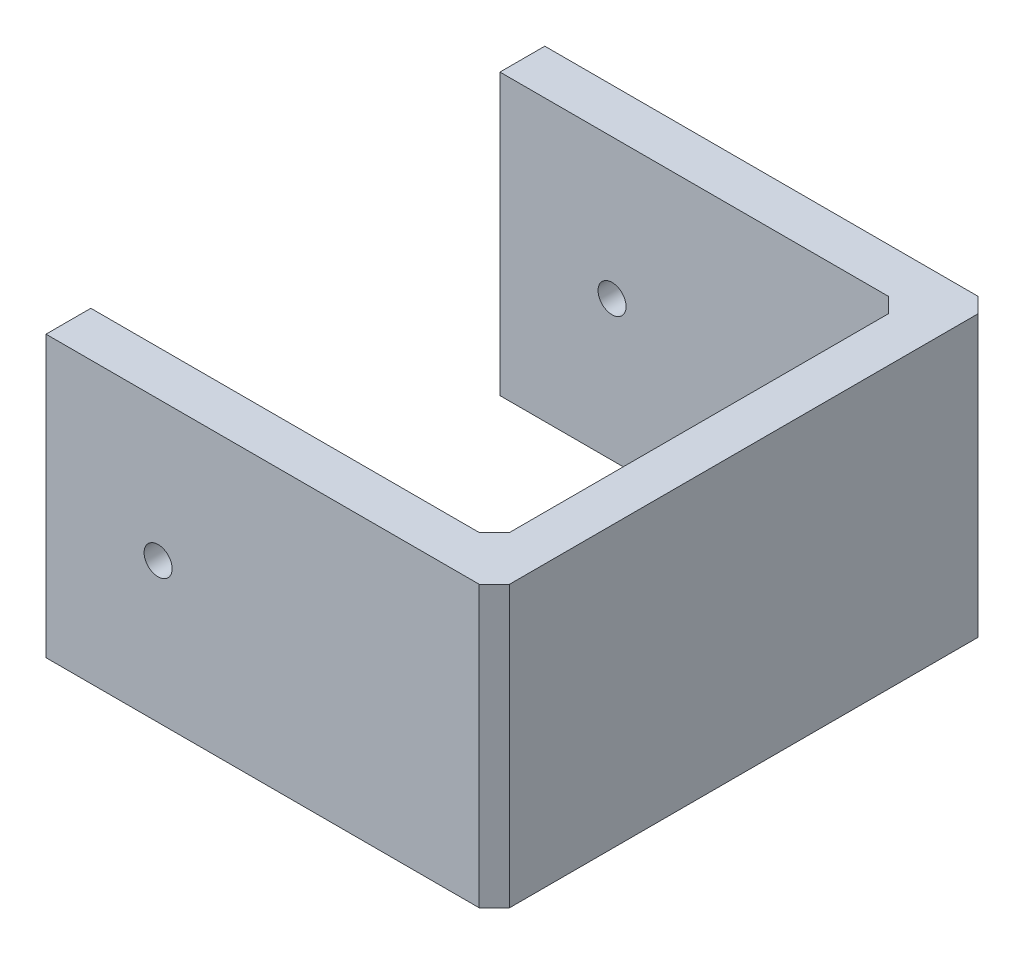
ISO-10303-21;
HEADER;
FILE_DESCRIPTION(('STEP AP214'),'2;1');
FILE_NAME('part.step','',(''),(''),'','','');
FILE_SCHEMA(('AUTOMOTIVE_DESIGN { 1 0 10303 214 1 1 1 1 }'));
ENDSEC;
DATA;
#1=APPLICATION_CONTEXT('core data for automotive mechanical design processes');
#2=APPLICATION_PROTOCOL_DEFINITION('international standard','automotive_design',2000,#1);
#3=PRODUCT_CONTEXT('',#1,'mechanical');
#4=PRODUCT('Part','Part','',(#3));
#5=PRODUCT_RELATED_PRODUCT_CATEGORY('part','',(#4));
#6=PRODUCT_DEFINITION_FORMATION('','',#4);
#7=PRODUCT_DEFINITION_CONTEXT('part definition',#1,'design');
#8=PRODUCT_DEFINITION('design','',#6,#7);
#9=PRODUCT_DEFINITION_SHAPE('','',#8);
#10=(LENGTH_UNIT() NAMED_UNIT(*) SI_UNIT(.MILLI.,.METRE.));
#11=(NAMED_UNIT(*) PLANE_ANGLE_UNIT() SI_UNIT($,.RADIAN.));
#12=(NAMED_UNIT(*) SI_UNIT($,.STERADIAN.) SOLID_ANGLE_UNIT());
#13=UNCERTAINTY_MEASURE_WITH_UNIT(LENGTH_MEASURE(1.E-05),#10,'distance_accuracy_value','');
#14=(GEOMETRIC_REPRESENTATION_CONTEXT(3) GLOBAL_UNCERTAINTY_ASSIGNED_CONTEXT((#13)) GLOBAL_UNIT_ASSIGNED_CONTEXT((#10,
#11,#12)) REPRESENTATION_CONTEXT('',''));
#15=CARTESIAN_POINT('',(0.,0.,0.));
#16=DIRECTION('',(0.,0.,1.));
#17=DIRECTION('',(1.,0.,0.));
#18=AXIS2_PLACEMENT_3D('',#15,#16,#17);
#19=CARTESIAN_POINT('',(0.,25.,-18.25));
#20=DIRECTION('',(-1.,0.,0.));
#21=DIRECTION('',(0.,0.,1.));
#22=AXIS2_PLACEMENT_3D('',#19,#20,#21);
#23=PLANE('',#22);
#24=DIRECTION('',(0.,0.,-1.));
#25=VECTOR('',#24,1.);
#26=CARTESIAN_POINT('',(0.,0.,-18.25));
#27=LINE('',#26,#25);
#28=CARTESIAN_POINT('',(0.,0.,-18.25));
#29=VERTEX_POINT('',#28);
#30=CARTESIAN_POINT('',(0.,0.,-22.25));
#31=VERTEX_POINT('',#30);
#32=EDGE_CURVE('E167',#29,#31,#27,.T.);
#33=ORIENTED_EDGE('',*,*,#32,.F.);
#34=DIRECTION('',(0.,-1.,0.));
#35=VECTOR('',#34,1.);
#36=CARTESIAN_POINT('',(0.,25.,-18.25));
#37=LINE('',#36,#35);
#38=CARTESIAN_POINT('',(0.,25.,-18.25));
#39=VERTEX_POINT('',#38);
#40=EDGE_CURVE('E11',#39,#29,#37,.T.);
#41=ORIENTED_EDGE('',*,*,#40,.F.);
#42=DIRECTION('',(0.,0.,-1.));
#43=VECTOR('',#42,1.);
#44=CARTESIAN_POINT('',(0.,25.,-18.25));
#45=LINE('',#44,#43);
#46=CARTESIAN_POINT('',(0.,25.,-22.25));
#47=VERTEX_POINT('',#46);
#48=EDGE_CURVE('E209',#39,#47,#45,.T.);
#49=ORIENTED_EDGE('',*,*,#48,.T.);
#50=DIRECTION('',(0.,-1.,0.));
#51=VECTOR('',#50,1.);
#52=CARTESIAN_POINT('',(0.,25.,-22.25));
#53=LINE('',#52,#51);
#54=EDGE_CURVE('E42',#47,#31,#53,.T.);
#55=ORIENTED_EDGE('',*,*,#54,.T.);
#56=EDGE_LOOP('',(#33,#41,#49,#55));
#57=FACE_BOUND('',#56,.T.);
#58=ADVANCED_FACE('F39',(#57),#23,.T.);
#59=CARTESIAN_POINT('',(0.,25.,-18.25));
#60=DIRECTION('',(0.,0.,-1.));
#61=DIRECTION('',(-1.,0.,0.));
#62=AXIS2_PLACEMENT_3D('',#59,#60,#61);
#63=PLANE('',#62);
#64=CARTESIAN_POINT('',(10.,12.5,-18.25));
#65=DIRECTION('',(0.,0.,-1.));
#66=DIRECTION('',(-1.,0.,0.));
#67=AXIS2_PLACEMENT_3D('',#64,#65,#66);
#68=CIRCLE('',#67,1.25);
#69=CARTESIAN_POINT('',(8.75,12.5,-18.25));
#70=VERTEX_POINT('',#69);
#71=EDGE_CURVE('E172',#70,#70,#68,.T.);
#72=ORIENTED_EDGE('',*,*,#71,.T.);
#73=EDGE_LOOP('',(#72));
#74=FACE_BOUND('',#73,.T.);
#75=DIRECTION('',(1.,0.,0.));
#76=VECTOR('',#75,1.);
#77=CARTESIAN_POINT('',(0.,0.,-18.25));
#78=LINE('',#77,#76);
#79=CARTESIAN_POINT('',(34.64701272,0.,-18.25));
#80=VERTEX_POINT('',#79);
#81=EDGE_CURVE('E97',#29,#80,#78,.T.);
#82=ORIENTED_EDGE('',*,*,#81,.T.);
#83=DIRECTION('',(0.,-1.,0.));
#84=VECTOR('',#83,1.);
#85=CARTESIAN_POINT('',(34.64701272,25.,-18.25));
#86=LINE('',#85,#84);
#87=CARTESIAN_POINT('',(34.64701272,25.,-18.25));
#88=VERTEX_POINT('',#87);
#89=EDGE_CURVE('E49',#88,#80,#86,.T.);
#90=ORIENTED_EDGE('',*,*,#89,.F.);
#91=DIRECTION('',(1.,0.,0.));
#92=VECTOR('',#91,1.);
#93=CARTESIAN_POINT('',(0.,25.,-18.25));
#94=LINE('',#93,#92);
#95=EDGE_CURVE('E140',#39,#88,#94,.T.);
#96=ORIENTED_EDGE('',*,*,#95,.F.);
#97=ORIENTED_EDGE('',*,*,#40,.T.);
#98=EDGE_LOOP('',(#82,#90,#96,#97));
#99=FACE_BOUND('',#98,.T.);
#100=ADVANCED_FACE('F298',(#74,#99),#63,.F.);
#101=CARTESIAN_POINT('',(34.64701272,25.,-18.25));
#102=DIRECTION('',(0.707106781186548,0.,-0.707106781186548));
#103=DIRECTION('',(-0.707106781186548,0.,-0.707106781186548));
#104=AXIS2_PLACEMENT_3D('',#101,#102,#103);
#105=PLANE('',#104);
#106=DIRECTION('',(0.707106781186548,0.,0.707106781186548));
#107=VECTOR('',#106,1.);
#108=CARTESIAN_POINT('',(34.64701272,0.,-18.25));
#109=LINE('',#108,#107);
#110=CARTESIAN_POINT('',(36.,0.,-16.89701272));
#111=VERTEX_POINT('',#110);
#112=EDGE_CURVE('E148',#80,#111,#109,.T.);
#113=ORIENTED_EDGE('',*,*,#112,.T.);
#114=DIRECTION('',(0.,-1.,0.));
#115=VECTOR('',#114,1.);
#116=CARTESIAN_POINT('',(36.,25.,-16.89701272));
#117=LINE('',#116,#115);
#118=CARTESIAN_POINT('',(36.,25.,-16.89701272));
#119=VERTEX_POINT('',#118);
#120=EDGE_CURVE('E145',#119,#111,#117,.T.);
#121=ORIENTED_EDGE('',*,*,#120,.F.);
#122=DIRECTION('',(0.707106781186548,0.,0.707106781186548));
#123=VECTOR('',#122,1.);
#124=CARTESIAN_POINT('',(34.64701272,25.,-18.25));
#125=LINE('',#124,#123);
#126=EDGE_CURVE('E133',#88,#119,#125,.T.);
#127=ORIENTED_EDGE('',*,*,#126,.F.);
#128=ORIENTED_EDGE('',*,*,#89,.T.);
#129=EDGE_LOOP('',(#113,#121,#127,#128));
#130=FACE_BOUND('',#129,.T.);
#131=ADVANCED_FACE('F146',(#130),#105,.F.);
#132=CARTESIAN_POINT('',(36.,25.,-16.89701272));
#133=DIRECTION('',(1.,0.,0.));
#134=DIRECTION('',(0.,0.,-1.));
#135=AXIS2_PLACEMENT_3D('',#132,#133,#134);
#136=PLANE('',#135);
#137=DIRECTION('',(0.,0.,1.));
#138=VECTOR('',#137,1.);
#139=CARTESIAN_POINT('',(36.,0.,-16.89701272));
#140=LINE('',#139,#138);
#141=CARTESIAN_POINT('',(36.,0.,16.89701272));
#142=VERTEX_POINT('',#141);
#143=EDGE_CURVE('E203',#111,#142,#140,.T.);
#144=ORIENTED_EDGE('',*,*,#143,.T.);
#145=DIRECTION('',(0.,-1.,0.));
#146=VECTOR('',#145,1.);
#147=CARTESIAN_POINT('',(36.,25.,16.89701272));
#148=LINE('',#147,#146);
#149=CARTESIAN_POINT('',(36.,25.,16.89701272));
#150=VERTEX_POINT('',#149);
#151=EDGE_CURVE('E152',#150,#142,#148,.T.);
#152=ORIENTED_EDGE('',*,*,#151,.F.);
#153=DIRECTION('',(0.,0.,1.));
#154=VECTOR('',#153,1.);
#155=CARTESIAN_POINT('',(36.,25.,-16.89701272));
#156=LINE('',#155,#154);
#157=EDGE_CURVE('E138',#119,#150,#156,.T.);
#158=ORIENTED_EDGE('',*,*,#157,.F.);
#159=ORIENTED_EDGE('',*,*,#120,.T.);
#160=EDGE_LOOP('',(#144,#152,#158,#159));
#161=FACE_BOUND('',#160,.T.);
#162=ADVANCED_FACE('F154',(#161),#136,.F.);
#163=CARTESIAN_POINT('',(36.,25.,16.89701272));
#164=DIRECTION('',(0.707106781186548,0.,0.707106781186548));
#165=DIRECTION('',(0.707106781186548,0.,-0.707106781186548));
#166=AXIS2_PLACEMENT_3D('',#163,#164,#165);
#167=PLANE('',#166);
#168=DIRECTION('',(-0.707106781186548,0.,0.707106781186548));
#169=VECTOR('',#168,1.);
#170=CARTESIAN_POINT('',(36.,0.,16.89701272));
#171=LINE('',#170,#169);
#172=CARTESIAN_POINT('',(34.64701272,0.,18.25));
#173=VERTEX_POINT('',#172);
#174=EDGE_CURVE('E199',#142,#173,#171,.T.);
#175=ORIENTED_EDGE('',*,*,#174,.T.);
#176=DIRECTION('',(0.,-1.,0.));
#177=VECTOR('',#176,1.);
#178=CARTESIAN_POINT('',(34.64701272,25.,18.25));
#179=LINE('',#178,#177);
#180=CARTESIAN_POINT('',(34.64701272,25.,18.25));
#181=VERTEX_POINT('',#180);
#182=EDGE_CURVE('E215',#181,#173,#179,.T.);
#183=ORIENTED_EDGE('',*,*,#182,.F.);
#184=DIRECTION('',(-0.707106781186548,0.,0.707106781186548));
#185=VECTOR('',#184,1.);
#186=CARTESIAN_POINT('',(36.,25.,16.89701272));
#187=LINE('',#186,#185);
#188=EDGE_CURVE('E158',#150,#181,#187,.T.);
#189=ORIENTED_EDGE('',*,*,#188,.F.);
#190=ORIENTED_EDGE('',*,*,#151,.T.);
#191=EDGE_LOOP('',(#175,#183,#189,#190));
#192=FACE_BOUND('',#191,.T.);
#193=ADVANCED_FACE('F242',(#192),#167,.F.);
#194=CARTESIAN_POINT('',(0.,25.,18.25));
#195=DIRECTION('',(0.,0.,-1.));
#196=DIRECTION('',(-1.,0.,0.));
#197=AXIS2_PLACEMENT_3D('',#194,#195,#196);
#198=PLANE('',#197);
#199=CARTESIAN_POINT('',(10.,12.5,18.25));
#200=DIRECTION('',(0.,0.,-1.));
#201=DIRECTION('',(-1.,0.,0.));
#202=AXIS2_PLACEMENT_3D('',#199,#200,#201);
#203=CIRCLE('',#202,1.25);
#204=CARTESIAN_POINT('',(8.75,12.5,18.25));
#205=VERTEX_POINT('',#204);
#206=EDGE_CURVE('E277',#205,#205,#203,.T.);
#207=ORIENTED_EDGE('',*,*,#206,.F.);
#208=EDGE_LOOP('',(#207));
#209=FACE_BOUND('',#208,.T.);
#210=DIRECTION('',(1.,0.,0.));
#211=VECTOR('',#210,1.);
#212=CARTESIAN_POINT('',(0.,0.,18.25));
#213=LINE('',#212,#211);
#214=CARTESIAN_POINT('',(0.,0.,18.25));
#215=VERTEX_POINT('',#214);
#216=EDGE_CURVE('E195',#215,#173,#213,.T.);
#217=ORIENTED_EDGE('',*,*,#216,.F.);
#218=DIRECTION('',(0.,-1.,0.));
#219=VECTOR('',#218,1.);
#220=CARTESIAN_POINT('',(0.,25.,18.25));
#221=LINE('',#220,#219);
#222=CARTESIAN_POINT('',(0.,25.,18.25));
#223=VERTEX_POINT('',#222);
#224=EDGE_CURVE('E218',#223,#215,#221,.T.);
#225=ORIENTED_EDGE('',*,*,#224,.F.);
#226=DIRECTION('',(1.,0.,0.));
#227=VECTOR('',#226,1.);
#228=CARTESIAN_POINT('',(0.,25.,18.25));
#229=LINE('',#228,#227);
#230=EDGE_CURVE('E161',#223,#181,#229,.T.);
#231=ORIENTED_EDGE('',*,*,#230,.T.);
#232=ORIENTED_EDGE('',*,*,#182,.T.);
#233=EDGE_LOOP('',(#217,#225,#231,#232));
#234=FACE_BOUND('',#233,.T.);
#235=ADVANCED_FACE('F313',(#209,#234),#198,.T.);
#236=CARTESIAN_POINT('',(0.,25.,18.25));
#237=DIRECTION('',(1.,0.,0.));
#238=DIRECTION('',(0.,0.,-1.));
#239=AXIS2_PLACEMENT_3D('',#236,#237,#238);
#240=PLANE('',#239);
#241=DIRECTION('',(0.,0.,1.));
#242=VECTOR('',#241,1.);
#243=CARTESIAN_POINT('',(0.,0.,18.25));
#244=LINE('',#243,#242);
#245=CARTESIAN_POINT('',(0.,0.,22.25));
#246=VERTEX_POINT('',#245);
#247=EDGE_CURVE('E192',#215,#246,#244,.T.);
#248=ORIENTED_EDGE('',*,*,#247,.T.);
#249=DIRECTION('',(0.,-1.,0.));
#250=VECTOR('',#249,1.);
#251=CARTESIAN_POINT('',(0.,25.,22.25));
#252=LINE('',#251,#250);
#253=CARTESIAN_POINT('',(0.,25.,22.25));
#254=VERTEX_POINT('',#253);
#255=EDGE_CURVE('E221',#254,#246,#252,.T.);
#256=ORIENTED_EDGE('',*,*,#255,.F.);
#257=DIRECTION('',(0.,0.,1.));
#258=VECTOR('',#257,1.);
#259=CARTESIAN_POINT('',(0.,25.,18.25));
#260=LINE('',#259,#258);
#261=EDGE_CURVE('E247',#223,#254,#260,.T.);
#262=ORIENTED_EDGE('',*,*,#261,.F.);
#263=ORIENTED_EDGE('',*,*,#224,.T.);
#264=EDGE_LOOP('',(#248,#256,#262,#263));
#265=FACE_BOUND('',#264,.T.);
#266=ADVANCED_FACE('F316',(#265),#240,.F.);
#267=CARTESIAN_POINT('',(0.,25.,22.25));
#268=DIRECTION('',(0.,0.,-1.));
#269=DIRECTION('',(-1.,0.,0.));
#270=AXIS2_PLACEMENT_3D('',#267,#268,#269);
#271=PLANE('',#270);
#272=CARTESIAN_POINT('',(10.,12.5,22.25));
#273=DIRECTION('',(0.,0.,1.));
#274=DIRECTION('',(1.,0.,0.));
#275=AXIS2_PLACEMENT_3D('',#272,#273,#274);
#276=CIRCLE('',#275,1.25);
#277=CARTESIAN_POINT('',(11.25,12.5,22.25));
#278=VERTEX_POINT('',#277);
#279=EDGE_CURVE('E282',#278,#278,#276,.T.);
#280=ORIENTED_EDGE('',*,*,#279,.F.);
#281=EDGE_LOOP('',(#280));
#282=FACE_BOUND('',#281,.T.);
#283=DIRECTION('',(1.,0.,0.));
#284=VECTOR('',#283,1.);
#285=CARTESIAN_POINT('',(0.,0.,22.25));
#286=LINE('',#285,#284);
#287=CARTESIAN_POINT('',(38.64701272,0.,22.25));
#288=VERTEX_POINT('',#287);
#289=EDGE_CURVE('E188',#246,#288,#286,.T.);
#290=ORIENTED_EDGE('',*,*,#289,.T.);
#291=DIRECTION('',(0.,-1.,0.));
#292=VECTOR('',#291,1.);
#293=CARTESIAN_POINT('',(38.64701272,25.,22.25));
#294=LINE('',#293,#292);
#295=CARTESIAN_POINT('',(38.64701272,25.,22.25));
#296=VERTEX_POINT('',#295);
#297=EDGE_CURVE('E225',#296,#288,#294,.T.);
#298=ORIENTED_EDGE('',*,*,#297,.F.);
#299=DIRECTION('',(1.,0.,0.));
#300=VECTOR('',#299,1.);
#301=CARTESIAN_POINT('',(0.,25.,22.25));
#302=LINE('',#301,#300);
#303=EDGE_CURVE('E252',#254,#296,#302,.T.);
#304=ORIENTED_EDGE('',*,*,#303,.F.);
#305=ORIENTED_EDGE('',*,*,#255,.T.);
#306=EDGE_LOOP('',(#290,#298,#304,#305));
#307=FACE_BOUND('',#306,.T.);
#308=ADVANCED_FACE('F320',(#282,#307),#271,.F.);
#309=CARTESIAN_POINT('',(40.,25.,20.89701272));
#310=DIRECTION('',(0.707106781186547,0.,0.707106781186548));
#311=DIRECTION('',(0.707106781186548,0.,-0.707106781186547));
#312=AXIS2_PLACEMENT_3D('',#309,#310,#311);
#313=PLANE('',#312);
#314=DIRECTION('',(-0.707106781186548,0.,0.707106781186547));
#315=VECTOR('',#314,1.);
#316=CARTESIAN_POINT('',(40.,0.,20.89701272));
#317=LINE('',#316,#315);
#318=CARTESIAN_POINT('',(40.,0.,20.89701272));
#319=VERTEX_POINT('',#318);
#320=EDGE_CURVE('E184',#319,#288,#317,.T.);
#321=ORIENTED_EDGE('',*,*,#320,.F.);
#322=DIRECTION('',(0.,-1.,0.));
#323=VECTOR('',#322,1.);
#324=CARTESIAN_POINT('',(40.,25.,20.89701272));
#325=LINE('',#324,#323);
#326=CARTESIAN_POINT('',(40.,25.,20.89701272));
#327=VERTEX_POINT('',#326);
#328=EDGE_CURVE('E228',#327,#319,#325,.T.);
#329=ORIENTED_EDGE('',*,*,#328,.F.);
#330=DIRECTION('',(-0.707106781186548,0.,0.707106781186547));
#331=VECTOR('',#330,1.);
#332=CARTESIAN_POINT('',(40.,25.,20.89701272));
#333=LINE('',#332,#331);
#334=EDGE_CURVE('E257',#327,#296,#333,.T.);
#335=ORIENTED_EDGE('',*,*,#334,.T.);
#336=ORIENTED_EDGE('',*,*,#297,.T.);
#337=EDGE_LOOP('',(#321,#329,#335,#336));
#338=FACE_BOUND('',#337,.T.);
#339=ADVANCED_FACE('F324',(#338),#313,.T.);
#340=CARTESIAN_POINT('',(40.,25.,-20.89701272));
#341=DIRECTION('',(1.,0.,0.));
#342=DIRECTION('',(0.,0.,-1.));
#343=AXIS2_PLACEMENT_3D('',#340,#341,#342);
#344=PLANE('',#343);
#345=DIRECTION('',(0.,0.,1.));
#346=VECTOR('',#345,1.);
#347=CARTESIAN_POINT('',(40.,0.,-20.89701272));
#348=LINE('',#347,#346);
#349=CARTESIAN_POINT('',(40.,0.,-20.89701272));
#350=VERTEX_POINT('',#349);
#351=EDGE_CURVE('E180',#350,#319,#348,.T.);
#352=ORIENTED_EDGE('',*,*,#351,.F.);
#353=DIRECTION('',(0.,-1.,0.));
#354=VECTOR('',#353,1.);
#355=CARTESIAN_POINT('',(40.,25.,-20.89701272));
#356=LINE('',#355,#354);
#357=CARTESIAN_POINT('',(40.,25.,-20.89701272));
#358=VERTEX_POINT('',#357);
#359=EDGE_CURVE('E231',#358,#350,#356,.T.);
#360=ORIENTED_EDGE('',*,*,#359,.F.);
#361=DIRECTION('',(0.,0.,1.));
#362=VECTOR('',#361,1.);
#363=CARTESIAN_POINT('',(40.,25.,-20.89701272));
#364=LINE('',#363,#362);
#365=EDGE_CURVE('E261',#358,#327,#364,.T.);
#366=ORIENTED_EDGE('',*,*,#365,.T.);
#367=ORIENTED_EDGE('',*,*,#328,.T.);
#368=EDGE_LOOP('',(#352,#360,#366,#367));
#369=FACE_BOUND('',#368,.T.);
#370=ADVANCED_FACE('F328',(#369),#344,.T.);
#371=CARTESIAN_POINT('',(38.64701272,25.,-22.25));
#372=DIRECTION('',(0.707106781186547,0.,-0.707106781186547));
#373=DIRECTION('',(-0.707106781186548,0.,-0.707106781186548));
#374=AXIS2_PLACEMENT_3D('',#371,#372,#373);
#375=PLANE('',#374);
#376=DIRECTION('',(0.707106781186547,0.,0.707106781186547));
#377=VECTOR('',#376,1.);
#378=CARTESIAN_POINT('',(38.64701272,0.,-22.25));
#379=LINE('',#378,#377);
#380=CARTESIAN_POINT('',(38.64701272,0.,-22.25));
#381=VERTEX_POINT('',#380);
#382=EDGE_CURVE('E176',#381,#350,#379,.T.);
#383=ORIENTED_EDGE('',*,*,#382,.F.);
#384=DIRECTION('',(0.,-1.,0.));
#385=VECTOR('',#384,1.);
#386=CARTESIAN_POINT('',(38.64701272,25.,-22.25));
#387=LINE('',#386,#385);
#388=CARTESIAN_POINT('',(38.64701272,25.,-22.25));
#389=VERTEX_POINT('',#388);
#390=EDGE_CURVE('E233',#389,#381,#387,.T.);
#391=ORIENTED_EDGE('',*,*,#390,.F.);
#392=DIRECTION('',(0.707106781186547,0.,0.707106781186547));
#393=VECTOR('',#392,1.);
#394=CARTESIAN_POINT('',(38.64701272,25.,-22.25));
#395=LINE('',#394,#393);
#396=EDGE_CURVE('E265',#389,#358,#395,.T.);
#397=ORIENTED_EDGE('',*,*,#396,.T.);
#398=ORIENTED_EDGE('',*,*,#359,.T.);
#399=EDGE_LOOP('',(#383,#391,#397,#398));
#400=FACE_BOUND('',#399,.T.);
#401=ADVANCED_FACE('F332',(#400),#375,.T.);
#402=CARTESIAN_POINT('',(0.,25.,-22.25));
#403=DIRECTION('',(0.,0.,-1.));
#404=DIRECTION('',(-1.,0.,0.));
#405=AXIS2_PLACEMENT_3D('',#402,#403,#404);
#406=PLANE('',#405);
#407=CARTESIAN_POINT('',(10.,12.5,-22.25));
#408=DIRECTION('',(0.,0.,1.));
#409=DIRECTION('',(1.,0.,0.));
#410=AXIS2_PLACEMENT_3D('',#407,#408,#409);
#411=CIRCLE('',#410,1.25);
#412=CARTESIAN_POINT('',(11.25,12.5,-22.25));
#413=VERTEX_POINT('',#412);
#414=EDGE_CURVE('E281',#413,#413,#411,.T.);
#415=ORIENTED_EDGE('',*,*,#414,.T.);
#416=EDGE_LOOP('',(#415));
#417=FACE_BOUND('',#416,.T.);
#418=DIRECTION('',(1.,0.,0.));
#419=VECTOR('',#418,1.);
#420=CARTESIAN_POINT('',(0.,0.,-22.25));
#421=LINE('',#420,#419);
#422=EDGE_CURVE('E171',#31,#381,#421,.T.);
#423=ORIENTED_EDGE('',*,*,#422,.F.);
#424=ORIENTED_EDGE('',*,*,#54,.F.);
#425=DIRECTION('',(1.,0.,0.));
#426=VECTOR('',#425,1.);
#427=CARTESIAN_POINT('',(0.,25.,-22.25));
#428=LINE('',#427,#426);
#429=EDGE_CURVE('E269',#47,#389,#428,.T.);
#430=ORIENTED_EDGE('',*,*,#429,.T.);
#431=ORIENTED_EDGE('',*,*,#390,.T.);
#432=EDGE_LOOP('',(#423,#424,#430,#431));
#433=FACE_BOUND('',#432,.T.);
#434=ADVANCED_FACE('F237',(#417,#433),#406,.T.);
#435=CARTESIAN_POINT('',(0.,25.,0.));
#436=DIRECTION('',(0.,-1.,0.));
#437=DIRECTION('',(0.,0.,-1.));
#438=AXIS2_PLACEMENT_3D('',#435,#436,#437);
#439=PLANE('',#438);
#440=ORIENTED_EDGE('',*,*,#48,.F.);
#441=ORIENTED_EDGE('',*,*,#95,.T.);
#442=ORIENTED_EDGE('',*,*,#126,.T.);
#443=ORIENTED_EDGE('',*,*,#157,.T.);
#444=ORIENTED_EDGE('',*,*,#188,.T.);
#445=ORIENTED_EDGE('',*,*,#230,.F.);
#446=ORIENTED_EDGE('',*,*,#261,.T.);
#447=ORIENTED_EDGE('',*,*,#303,.T.);
#448=ORIENTED_EDGE('',*,*,#334,.F.);
#449=ORIENTED_EDGE('',*,*,#365,.F.);
#450=ORIENTED_EDGE('',*,*,#396,.F.);
#451=ORIENTED_EDGE('',*,*,#429,.F.);
#452=EDGE_LOOP('',(#440,#441,#442,#443,#444,#445,#446,#447,#448,#449,#450,#451));
#453=FACE_BOUND('',#452,.T.);
#454=ADVANCED_FACE('F136',(#453),#439,.F.);
#455=CARTESIAN_POINT('',(0.,0.,0.));
#456=DIRECTION('',(0.,-1.,0.));
#457=DIRECTION('',(0.,0.,-1.));
#458=AXIS2_PLACEMENT_3D('',#455,#456,#457);
#459=PLANE('',#458);
#460=ORIENTED_EDGE('',*,*,#32,.T.);
#461=ORIENTED_EDGE('',*,*,#422,.T.);
#462=ORIENTED_EDGE('',*,*,#382,.T.);
#463=ORIENTED_EDGE('',*,*,#351,.T.);
#464=ORIENTED_EDGE('',*,*,#320,.T.);
#465=ORIENTED_EDGE('',*,*,#289,.F.);
#466=ORIENTED_EDGE('',*,*,#247,.F.);
#467=ORIENTED_EDGE('',*,*,#216,.T.);
#468=ORIENTED_EDGE('',*,*,#174,.F.);
#469=ORIENTED_EDGE('',*,*,#143,.F.);
#470=ORIENTED_EDGE('',*,*,#112,.F.);
#471=ORIENTED_EDGE('',*,*,#81,.F.);
#472=EDGE_LOOP('',(#460,#461,#462,#463,#464,#465,#466,#467,#468,#469,#470,#471));
#473=FACE_BOUND('',#472,.T.);
#474=ADVANCED_FACE('F239',(#473),#459,.T.);
#475=CARTESIAN_POINT('',(10.,12.5,-22.25));
#476=DIRECTION('',(0.,0.,1.));
#477=DIRECTION('',(1.,0.,0.));
#478=AXIS2_PLACEMENT_3D('',#475,#476,#477);
#479=CYLINDRICAL_SURFACE('',#478,1.25);
#480=ORIENTED_EDGE('',*,*,#414,.F.);
#481=EDGE_LOOP('',(#480));
#482=FACE_BOUND('',#481,.T.);
#483=ORIENTED_EDGE('',*,*,#71,.F.);
#484=EDGE_LOOP('',(#483));
#485=FACE_BOUND('',#484,.T.);
#486=ADVANCED_FACE('F291',(#482,#485),#479,.F.);
#487=ORIENTED_EDGE('',*,*,#206,.T.);
#488=EDGE_LOOP('',(#487));
#489=FACE_BOUND('',#488,.T.);
#490=ORIENTED_EDGE('',*,*,#279,.T.);
#491=EDGE_LOOP('',(#490));
#492=FACE_BOUND('',#491,.T.);
#493=ADVANCED_FACE('F294',(#489,#492),#479,.F.);
#494=CLOSED_SHELL('',(#58,#100,#131,#162,#193,#235,#266,#308,#339,#370,#401,#434,#454,#474,#486,#493));
#495=MANIFOLD_SOLID_BREP('B2',#494);
#496=ADVANCED_BREP_SHAPE_REPRESENTATION('',(#18,#495),#14);
#497=SHAPE_DEFINITION_REPRESENTATION(#9,#496);
ENDSEC;
END-ISO-10303-21;
